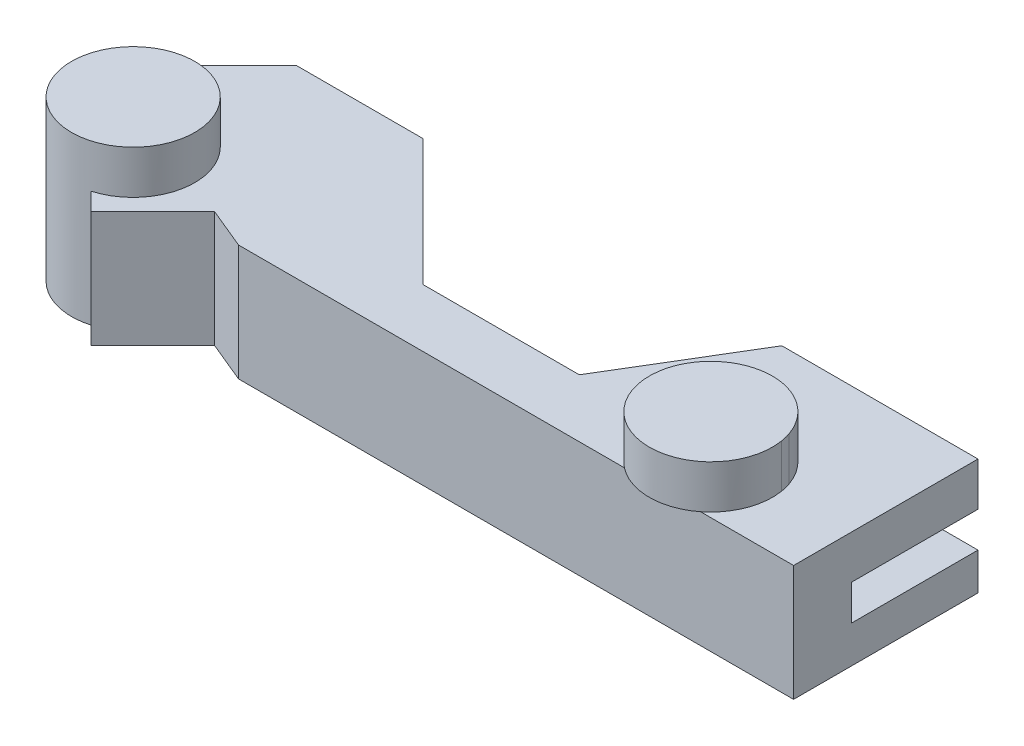
ISO-10303-21;
HEADER;
FILE_DESCRIPTION(('STEP AP214'),'2;1');
FILE_NAME('part.step','',(''),(''),'','','');
FILE_SCHEMA(('AUTOMOTIVE_DESIGN { 1 0 10303 214 1 1 1 1 }'));
ENDSEC;
DATA;
#1=APPLICATION_CONTEXT('core data for automotive mechanical design processes');
#2=APPLICATION_PROTOCOL_DEFINITION('international standard','automotive_design',2000,#1);
#3=PRODUCT_CONTEXT('',#1,'mechanical');
#4=PRODUCT('Part','Part','',(#3));
#5=PRODUCT_RELATED_PRODUCT_CATEGORY('part','',(#4));
#6=PRODUCT_DEFINITION_FORMATION('','',#4);
#7=PRODUCT_DEFINITION_CONTEXT('part definition',#1,'design');
#8=PRODUCT_DEFINITION('design','',#6,#7);
#9=PRODUCT_DEFINITION_SHAPE('','',#8);
#10=(LENGTH_UNIT() NAMED_UNIT(*) SI_UNIT(.MILLI.,.METRE.));
#11=(NAMED_UNIT(*) PLANE_ANGLE_UNIT() SI_UNIT($,.RADIAN.));
#12=(NAMED_UNIT(*) SI_UNIT($,.STERADIAN.) SOLID_ANGLE_UNIT());
#13=UNCERTAINTY_MEASURE_WITH_UNIT(LENGTH_MEASURE(1.E-05),#10,'distance_accuracy_value','');
#14=(GEOMETRIC_REPRESENTATION_CONTEXT(3) GLOBAL_UNCERTAINTY_ASSIGNED_CONTEXT((#13)) GLOBAL_UNIT_ASSIGNED_CONTEXT((#10,
#11,#12)) REPRESENTATION_CONTEXT('',''));
#15=CARTESIAN_POINT('',(0.,0.,0.));
#16=DIRECTION('',(0.,0.,1.));
#17=DIRECTION('',(1.,0.,0.));
#18=AXIS2_PLACEMENT_3D('',#15,#16,#17);
#19=CARTESIAN_POINT('',(29.2353300717633,6.,0.666861214855637));
#20=DIRECTION('',(0.,-1.,0.));
#21=DIRECTION('',(0.,0.,-1.));
#22=AXIS2_PLACEMENT_3D('',#19,#20,#21);
#23=CYLINDRICAL_SURFACE('',#22,4.25);
#24=DIRECTION('',(0.,-1.,0.));
#25=VECTOR('',#24,1.);
#26=CARTESIAN_POINT('',(33.2495376535951,4.5,-0.729074847420829));
#27=LINE('',#26,#25);
#28=CARTESIAN_POINT('',(33.2495376535951,6.,-0.729074847420828));
#29=VERTEX_POINT('',#28);
#30=CARTESIAN_POINT('',(33.2495376535951,3.,-0.729074847420828));
#31=VERTEX_POINT('',#30);
#32=EDGE_CURVE('E240',#29,#31,#27,.T.);
#33=ORIENTED_EDGE('',*,*,#32,.F.);
#34=CARTESIAN_POINT('',(29.2353300717633,6.,0.666861214855637));
#35=DIRECTION('',(0.,1.,0.));
#36=DIRECTION('',(0.,0.,1.));
#37=AXIS2_PLACEMENT_3D('',#34,#35,#36);
#38=CIRCLE('',#37,4.25);
#39=CARTESIAN_POINT('',(33.4326859204043,6.,0.));
#40=VERTEX_POINT('',#39);
#41=EDGE_CURVE('E528',#40,#29,#38,.T.);
#42=ORIENTED_EDGE('',*,*,#41,.F.);
#43=DIRECTION('',(0.,-1.,0.));
#44=VECTOR('',#43,1.);
#45=CARTESIAN_POINT('',(33.4326859204043,6.,0.));
#46=LINE('',#45,#44);
#47=CARTESIAN_POINT('',(33.4326859204043,3.,0.));
#48=VERTEX_POINT('',#47);
#49=EDGE_CURVE('E268',#40,#48,#46,.T.);
#50=ORIENTED_EDGE('',*,*,#49,.T.);
#51=CARTESIAN_POINT('',(29.2353300717633,3.,0.666861214855637));
#52=DIRECTION('',(0.,1.,0.));
#53=DIRECTION('',(0.,0.,1.));
#54=AXIS2_PLACEMENT_3D('',#51,#52,#53);
#55=CIRCLE('',#54,4.25);
#56=EDGE_CURVE('E49',#48,#31,#55,.T.);
#57=ORIENTED_EDGE('',*,*,#56,.T.);
#58=EDGE_LOOP('',(#33,#42,#50,#57));
#59=FACE_BOUND('',#58,.T.);
#60=ADVANCED_FACE('F45',(#59),#23,.T.);
#61=DIRECTION('',(0.,-1.,0.));
#62=VECTOR('',#61,1.);
#63=CARTESIAN_POINT('',(25.2211224899314,4.5,-0.729074847420827));
#64=LINE('',#63,#62);
#65=CARTESIAN_POINT('',(25.2211224899314,3.,-0.729074847420827));
#66=VERTEX_POINT('',#65);
#67=CARTESIAN_POINT('',(25.2211224899314,6.,-0.729074847420827));
#68=VERTEX_POINT('',#67);
#69=EDGE_CURVE('E255',#66,#68,#64,.F.);
#70=ORIENTED_EDGE('',*,*,#69,.F.);
#71=CARTESIAN_POINT('',(25.0379742231222,3.,0.));
#72=VERTEX_POINT('',#71);
#73=EDGE_CURVE('E263',#66,#72,#55,.T.);
#74=ORIENTED_EDGE('',*,*,#73,.T.);
#75=DIRECTION('',(0.,-1.,0.));
#76=VECTOR('',#75,1.);
#77=CARTESIAN_POINT('',(25.0379742231222,6.,0.));
#78=LINE('',#77,#76);
#79=CARTESIAN_POINT('',(25.0379742231222,6.,0.));
#80=VERTEX_POINT('',#79);
#81=EDGE_CURVE('E524',#80,#72,#78,.T.);
#82=ORIENTED_EDGE('',*,*,#81,.F.);
#83=EDGE_CURVE('E521',#68,#80,#38,.T.);
#84=ORIENTED_EDGE('',*,*,#83,.F.);
#85=EDGE_LOOP('',(#70,#74,#82,#84));
#86=FACE_BOUND('',#85,.T.);
#87=ADVANCED_FACE('F628',(#86),#23,.T.);
#88=CARTESIAN_POINT('',(0.,6.,0.));
#89=DIRECTION('',(0.,0.,1.));
#90=DIRECTION('',(1.,0.,0.));
#91=AXIS2_PLACEMENT_3D('',#88,#89,#90);
#92=PLANE('',#91);
#93=DIRECTION('',(1.,0.,0.));
#94=VECTOR('',#93,1.);
#95=CARTESIAN_POINT('',(0.,3.,0.));
#96=LINE('',#95,#94);
#97=CARTESIAN_POINT('',(25.0391661758015,3.,0.));
#98=VERTEX_POINT('',#97);
#99=EDGE_CURVE('E276',#72,#98,#96,.T.);
#100=ORIENTED_EDGE('',*,*,#99,.T.);
#101=DIRECTION('',(0.,-1.,0.));
#102=VECTOR('',#101,1.);
#103=CARTESIAN_POINT('',(25.0391661758015,6.,0.));
#104=LINE('',#103,#102);
#105=CARTESIAN_POINT('',(25.0391661758015,6.,0.));
#106=VERTEX_POINT('',#105);
#107=EDGE_CURVE('E11',#98,#106,#104,.F.);
#108=ORIENTED_EDGE('',*,*,#107,.T.);
#109=DIRECTION('',(-1.,0.,0.));
#110=VECTOR('',#109,1.);
#111=CARTESIAN_POINT('',(0.,6.,0.));
#112=LINE('',#111,#110);
#113=EDGE_CURVE('E511',#106,#80,#112,.T.);
#114=ORIENTED_EDGE('',*,*,#113,.T.);
#115=ORIENTED_EDGE('',*,*,#81,.T.);
#116=EDGE_LOOP('',(#100,#108,#114,#115));
#117=FACE_BOUND('',#116,.T.);
#118=ADVANCED_FACE('F608',(#117),#92,.T.);
#119=CARTESIAN_POINT('',(33.4314939677251,6.,0.));
#120=VERTEX_POINT('',#119);
#121=EDGE_CURVE('E518',#40,#120,#112,.T.);
#122=ORIENTED_EDGE('',*,*,#121,.T.);
#123=DIRECTION('',(0.,-1.,0.));
#124=VECTOR('',#123,1.);
#125=CARTESIAN_POINT('',(33.4314939677251,6.,0.));
#126=LINE('',#125,#124);
#127=CARTESIAN_POINT('',(33.4314939677251,3.,0.));
#128=VERTEX_POINT('',#127);
#129=EDGE_CURVE('E56',#120,#128,#126,.T.);
#130=ORIENTED_EDGE('',*,*,#129,.T.);
#131=EDGE_CURVE('E281',#128,#48,#96,.T.);
#132=ORIENTED_EDGE('',*,*,#131,.T.);
#133=ORIENTED_EDGE('',*,*,#49,.F.);
#134=EDGE_LOOP('',(#122,#130,#132,#133));
#135=FACE_BOUND('',#134,.T.);
#136=ADVANCED_FACE('F593',(#135),#92,.T.);
#137=CARTESIAN_POINT('',(0.,0.,0.));
#138=DIRECTION('',(0.,1.,0.));
#139=DIRECTION('',(0.,0.,1.));
#140=AXIS2_PLACEMENT_3D('',#137,#138,#139);
#141=PLANE('',#140);
#142=DIRECTION('',(1.,0.,0.));
#143=VECTOR('',#142,1.);
#144=CARTESIAN_POINT('',(0.,0.,0.));
#145=LINE('',#144,#143);
#146=CARTESIAN_POINT('',(19.4997551783498,0.,0.));
#147=VERTEX_POINT('',#146);
#148=CARTESIAN_POINT('',(38.28,0.,0.));
#149=VERTEX_POINT('',#148);
#150=EDGE_CURVE('E357',#147,#149,#145,.T.);
#151=ORIENTED_EDGE('',*,*,#150,.F.);
#152=DIRECTION('',(0.516250655987323,0.,-0.856437540158451));
#153=VECTOR('',#152,1.);
#154=CARTESIAN_POINT('',(14.3027830006851,0.,8.62155237284659));
#155=LINE('',#154,#153);
#156=CARTESIAN_POINT('',(24.755242586032,0.,-8.71862661203013));
#157=VERTEX_POINT('',#156);
#158=EDGE_CURVE('E309',#147,#157,#155,.T.);
#159=ORIENTED_EDGE('',*,*,#158,.T.);
#160=DIRECTION('',(-1.,0.,0.));
#161=VECTOR('',#160,1.);
#162=CARTESIAN_POINT('',(0.,0.,-8.71862661203013));
#163=LINE('',#162,#161);
#164=CARTESIAN_POINT('',(38.28,0.,-8.71862661203013));
#165=VERTEX_POINT('',#164);
#166=EDGE_CURVE('E305',#165,#157,#163,.T.);
#167=ORIENTED_EDGE('',*,*,#166,.F.);
#168=DIRECTION('',(0.,0.,1.));
#169=VECTOR('',#168,1.);
#170=CARTESIAN_POINT('',(38.28,0.,0.));
#171=LINE('',#170,#169);
#172=EDGE_CURVE('E301',#165,#149,#171,.T.);
#173=ORIENTED_EDGE('',*,*,#172,.T.);
#174=EDGE_LOOP('',(#151,#159,#167,#173));
#175=FACE_BOUND('',#174,.T.);
#176=ADVANCED_FACE('F693',(#175),#141,.F.);
#177=CARTESIAN_POINT('',(0.,0.,0.));
#178=VERTEX_POINT('',#177);
#179=CARTESIAN_POINT('',(8.71862661203034,0.,0.));
#180=VERTEX_POINT('',#179);
#181=EDGE_CURVE('E501',#178,#180,#145,.T.);
#182=ORIENTED_EDGE('',*,*,#181,.F.);
#183=DIRECTION('',(-0.707106781186548,0.,-0.707106781186548));
#184=VECTOR('',#183,1.);
#185=CARTESIAN_POINT('',(0.,0.,0.));
#186=LINE('',#185,#184);
#187=CARTESIAN_POINT('',(-8.71862661203013,0.,-8.71862661203013));
#188=VERTEX_POINT('',#187);
#189=EDGE_CURVE('E464',#178,#188,#186,.T.);
#190=ORIENTED_EDGE('',*,*,#189,.T.);
#191=DIRECTION('',(1.,0.,0.));
#192=VECTOR('',#191,1.);
#193=CARTESIAN_POINT('',(0.,0.,-8.71862661203013));
#194=LINE('',#193,#192);
#195=CARTESIAN_POINT('',(0.,0.,-8.71862661203013));
#196=VERTEX_POINT('',#195);
#197=EDGE_CURVE('E297',#188,#196,#194,.T.);
#198=ORIENTED_EDGE('',*,*,#197,.T.);
#199=DIRECTION('',(0.707106781186556,0.,0.707106781186539));
#200=VECTOR('',#199,1.);
#201=CARTESIAN_POINT('',(4.35931330601507,0.,-4.35931330601517));
#202=LINE('',#201,#200);
#203=EDGE_CURVE('E292',#196,#180,#202,.T.);
#204=ORIENTED_EDGE('',*,*,#203,.T.);
#205=EDGE_LOOP('',(#182,#190,#198,#204));
#206=FACE_BOUND('',#205,.T.);
#207=ADVANCED_FACE('F695',(#206),#141,.F.);
#208=CARTESIAN_POINT('',(-9.48275490536332,6.,1.78878128546955));
#209=DIRECTION('',(0.,-1.,0.));
#210=DIRECTION('',(0.,0.,-1.));
#211=AXIS2_PLACEMENT_3D('',#208,#209,#210);
#212=CYLINDRICAL_SURFACE('',#211,4.25);
#213=CARTESIAN_POINT('',(-9.48275490536332,6.,1.78878128546955));
#214=DIRECTION('',(0.,1.,0.));
#215=DIRECTION('',(0.,0.,1.));
#216=AXIS2_PLACEMENT_3D('',#213,#214,#215);
#217=CIRCLE('',#216,4.25);
#218=CARTESIAN_POINT('',(-9.48275490536332,6.,6.03878128546955));
#219=VERTEX_POINT('',#218);
#220=EDGE_CURVE('E353',#219,#219,#217,.T.);
#221=ORIENTED_EDGE('',*,*,#220,.F.);
#222=EDGE_LOOP('',(#221));
#223=FACE_BOUND('',#222,.T.);
#224=CARTESIAN_POINT('',(-9.48275490536332,3.,1.78878128546955));
#225=DIRECTION('',(0.,1.,0.));
#226=DIRECTION('',(0.,0.,1.));
#227=AXIS2_PLACEMENT_3D('',#224,#225,#226);
#228=CIRCLE('',#227,4.25);
#229=CARTESIAN_POINT('',(-8.29388432029366,3.,5.86911052855229));
#230=VERTEX_POINT('',#229);
#231=CARTESIAN_POINT('',(-13.5630841484461,3.,0.59991070039987));
#232=VERTEX_POINT('',#231);
#233=EDGE_CURVE('E562',#230,#232,#228,.T.);
#234=ORIENTED_EDGE('',*,*,#233,.T.);
#235=DIRECTION('',(0.,-1.,0.));
#236=VECTOR('',#235,1.);
#237=CARTESIAN_POINT('',(-13.5630841484461,3.,0.599910700399871));
#238=LINE('',#237,#236);
#239=CARTESIAN_POINT('',(-13.5630841484461,-5.,0.599910700399871));
#240=VERTEX_POINT('',#239);
#241=EDGE_CURVE('E333',#232,#240,#238,.T.);
#242=ORIENTED_EDGE('',*,*,#241,.T.);
#243=CARTESIAN_POINT('',(-9.48275490536332,-5.,1.78878128546955));
#244=DIRECTION('',(0.,1.,0.));
#245=DIRECTION('',(0.,0.,1.));
#246=AXIS2_PLACEMENT_3D('',#243,#244,#245);
#247=CIRCLE('',#246,4.25);
#248=CARTESIAN_POINT('',(-8.29388432029366,-5.,5.86911052855229));
#249=VERTEX_POINT('',#248);
#250=EDGE_CURVE('E463',#240,#249,#247,.T.);
#251=ORIENTED_EDGE('',*,*,#250,.T.);
#252=DIRECTION('',(0.,-1.,0.));
#253=VECTOR('',#252,1.);
#254=CARTESIAN_POINT('',(-8.29388432029366,3.,5.86911052855229));
#255=LINE('',#254,#253);
#256=EDGE_CURVE('E330',#230,#249,#255,.T.);
#257=ORIENTED_EDGE('',*,*,#256,.F.);
#258=EDGE_LOOP('',(#234,#242,#251,#257));
#259=FACE_BOUND('',#258,.T.);
#260=ADVANCED_FACE('F47',(#223,#259),#212,.T.);
#261=CARTESIAN_POINT('',(0.,6.,0.));
#262=DIRECTION('',(0.,1.,0.));
#263=DIRECTION('',(0.,0.,1.));
#264=AXIS2_PLACEMENT_3D('',#261,#262,#263);
#265=PLANE('',#264);
#266=ORIENTED_EDGE('',*,*,#220,.T.);
#267=EDGE_LOOP('',(#266));
#268=FACE_BOUND('',#267,.T.);
#269=ADVANCED_FACE('F646',(#268),#265,.T.);
#270=CARTESIAN_POINT('',(0.,3.,0.));
#271=DIRECTION('',(0.,0.,-1.));
#272=DIRECTION('',(-1.,0.,0.));
#273=AXIS2_PLACEMENT_3D('',#270,#271,#272);
#274=PLANE('',#273);
#275=DIRECTION('',(1.,0.,0.));
#276=VECTOR('',#275,1.);
#277=CARTESIAN_POINT('',(0.,-2.44,0.));
#278=LINE('',#277,#276);
#279=CARTESIAN_POINT('',(0.,-2.44,0.));
#280=VERTEX_POINT('',#279);
#281=CARTESIAN_POINT('',(8.71862661203009,-2.44,0.));
#282=VERTEX_POINT('',#281);
#283=EDGE_CURVE('E441',#280,#282,#278,.T.);
#284=ORIENTED_EDGE('',*,*,#283,.F.);
#285=DIRECTION('',(0.,1.,0.));
#286=VECTOR('',#285,1.);
#287=CARTESIAN_POINT('',(0.,-5.,0.));
#288=LINE('',#287,#286);
#289=EDGE_CURVE('E513',#280,#178,#288,.T.);
#290=ORIENTED_EDGE('',*,*,#289,.T.);
#291=ORIENTED_EDGE('',*,*,#181,.T.);
#292=DIRECTION('',(0.,-1.,0.));
#293=VECTOR('',#292,1.);
#294=CARTESIAN_POINT('',(8.71862661203034,3.,0.));
#295=LINE('',#294,#293);
#296=CARTESIAN_POINT('',(8.71862661203034,3.,0.));
#297=VERTEX_POINT('',#296);
#298=EDGE_CURVE('E349',#297,#180,#295,.T.);
#299=ORIENTED_EDGE('',*,*,#298,.F.);
#300=CARTESIAN_POINT('',(19.4997551783498,3.,0.));
#301=VERTEX_POINT('',#300);
#302=EDGE_CURVE('E283',#297,#301,#96,.T.);
#303=ORIENTED_EDGE('',*,*,#302,.T.);
#304=DIRECTION('',(0.,-1.,0.));
#305=VECTOR('',#304,1.);
#306=CARTESIAN_POINT('',(19.4997551783498,3.,0.));
#307=LINE('',#306,#305);
#308=EDGE_CURVE('E270',#301,#147,#307,.T.);
#309=ORIENTED_EDGE('',*,*,#308,.T.);
#310=ORIENTED_EDGE('',*,*,#150,.T.);
#311=DIRECTION('',(0.,1.,0.));
#312=VECTOR('',#311,1.);
#313=CARTESIAN_POINT('',(38.28,-5.,0.));
#314=LINE('',#313,#312);
#315=CARTESIAN_POINT('',(38.28,-2.44,0.));
#316=VERTEX_POINT('',#315);
#317=EDGE_CURVE('E500',#316,#149,#314,.T.);
#318=ORIENTED_EDGE('',*,*,#317,.F.);
#319=CARTESIAN_POINT('',(19.4997551783498,-2.44,0.));
#320=VERTEX_POINT('',#319);
#321=EDGE_CURVE('E458',#320,#316,#278,.T.);
#322=ORIENTED_EDGE('',*,*,#321,.F.);
#323=DIRECTION('',(0.,-1.,0.));
#324=VECTOR('',#323,1.);
#325=CARTESIAN_POINT('',(19.4997551783498,-2.44,0.));
#326=LINE('',#325,#324);
#327=CARTESIAN_POINT('',(19.4997551783498,-5.,0.));
#328=VERTEX_POINT('',#327);
#329=EDGE_CURVE('E445',#320,#328,#326,.T.);
#330=ORIENTED_EDGE('',*,*,#329,.T.);
#331=DIRECTION('',(1.,0.,0.));
#332=VECTOR('',#331,1.);
#333=CARTESIAN_POINT('',(0.,-5.,0.));
#334=LINE('',#333,#332);
#335=CARTESIAN_POINT('',(8.71862661203009,-5.,0.));
#336=VERTEX_POINT('',#335);
#337=EDGE_CURVE('E488',#336,#328,#334,.T.);
#338=ORIENTED_EDGE('',*,*,#337,.F.);
#339=DIRECTION('',(0.,-1.,0.));
#340=VECTOR('',#339,1.);
#341=CARTESIAN_POINT('',(8.71862661203009,-2.44,0.));
#342=LINE('',#341,#340);
#343=EDGE_CURVE('E449',#282,#336,#342,.T.);
#344=ORIENTED_EDGE('',*,*,#343,.F.);
#345=EDGE_LOOP('',(#284,#290,#291,#299,#303,#309,#310,#318,#322,#330,#338,#344));
#346=FACE_BOUND('',#345,.T.);
#347=ADVANCED_FACE('F642',(#346),#274,.T.);
#348=CARTESIAN_POINT('',(4.35931330601507,3.,-4.35931330601517));
#349=DIRECTION('',(0.707106781186539,0.,-0.707106781186556));
#350=DIRECTION('',(-0.707106781186556,0.,-0.707106781186539));
#351=AXIS2_PLACEMENT_3D('',#348,#349,#350);
#352=PLANE('',#351);
#353=ORIENTED_EDGE('',*,*,#203,.F.);
#354=DIRECTION('',(0.,-1.,0.));
#355=VECTOR('',#354,1.);
#356=CARTESIAN_POINT('',(0.,3.,-8.71862661203013));
#357=LINE('',#356,#355);
#358=CARTESIAN_POINT('',(0.,3.,-8.71862661203013));
#359=VERTEX_POINT('',#358);
#360=EDGE_CURVE('E346',#359,#196,#357,.T.);
#361=ORIENTED_EDGE('',*,*,#360,.F.);
#362=DIRECTION('',(0.707106781186556,0.,0.707106781186539));
#363=VECTOR('',#362,1.);
#364=CARTESIAN_POINT('',(4.35931330601507,3.,-4.35931330601517));
#365=LINE('',#364,#363);
#366=EDGE_CURVE('E543',#359,#297,#365,.T.);
#367=ORIENTED_EDGE('',*,*,#366,.T.);
#368=ORIENTED_EDGE('',*,*,#298,.T.);
#369=EDGE_LOOP('',(#353,#361,#367,#368));
#370=FACE_BOUND('',#369,.T.);
#371=ADVANCED_FACE('F645',(#370),#352,.T.);
#372=CARTESIAN_POINT('',(0.,3.,-8.71862661203013));
#373=DIRECTION('',(0.,0.,-1.));
#374=DIRECTION('',(-1.,0.,0.));
#375=AXIS2_PLACEMENT_3D('',#372,#373,#374);
#376=PLANE('',#375);
#377=ORIENTED_EDGE('',*,*,#197,.F.);
#378=DIRECTION('',(0.,-1.,0.));
#379=VECTOR('',#378,1.);
#380=CARTESIAN_POINT('',(-8.71862661203013,3.,-8.71862661203013));
#381=LINE('',#380,#379);
#382=CARTESIAN_POINT('',(-8.71862661203013,3.,-8.71862661203013));
#383=VERTEX_POINT('',#382);
#384=EDGE_CURVE('E342',#383,#188,#381,.T.);
#385=ORIENTED_EDGE('',*,*,#384,.F.);
#386=DIRECTION('',(1.,0.,0.));
#387=VECTOR('',#386,1.);
#388=CARTESIAN_POINT('',(0.,3.,-8.71862661203013));
#389=LINE('',#388,#387);
#390=EDGE_CURVE('E547',#383,#359,#389,.T.);
#391=ORIENTED_EDGE('',*,*,#390,.T.);
#392=ORIENTED_EDGE('',*,*,#360,.T.);
#393=EDGE_LOOP('',(#377,#385,#391,#392));
#394=FACE_BOUND('',#393,.T.);
#395=ADVANCED_FACE('F683',(#394),#376,.T.);
#396=CARTESIAN_POINT('',(-8.71862661203013,3.,-8.71862661203013));
#397=DIRECTION('',(0.707106781186547,0.,0.707106781186548));
#398=DIRECTION('',(0.707106781186548,0.,-0.707106781186547));
#399=AXIS2_PLACEMENT_3D('',#396,#397,#398);
#400=PLANE('',#399);
#401=ORIENTED_EDGE('',*,*,#384,.T.);
#402=DIRECTION('',(0.,1.,0.));
#403=VECTOR('',#402,1.);
#404=CARTESIAN_POINT('',(-8.71862661203013,-5.,-8.71862661203013));
#405=LINE('',#404,#403);
#406=CARTESIAN_POINT('',(-8.71862661203013,-2.44,-8.71862661203013));
#407=VERTEX_POINT('',#406);
#408=EDGE_CURVE('E512',#407,#188,#405,.T.);
#409=ORIENTED_EDGE('',*,*,#408,.F.);
#410=CARTESIAN_POINT('',(-8.71862661203013,-5.,-8.71862661203013));
#411=VERTEX_POINT('',#410);
#412=EDGE_CURVE('E507',#411,#407,#405,.T.);
#413=ORIENTED_EDGE('',*,*,#412,.F.);
#414=DIRECTION('',(-0.707106781186548,0.,0.707106781186547));
#415=VECTOR('',#414,1.);
#416=CARTESIAN_POINT('',(-8.71862661203013,-5.,-8.71862661203013));
#417=LINE('',#416,#415);
#418=CARTESIAN_POINT('',(-11.5614558189707,-5.,-5.87579740508959));
#419=VERTEX_POINT('',#418);
#420=EDGE_CURVE('E492',#411,#419,#417,.T.);
#421=ORIENTED_EDGE('',*,*,#420,.T.);
#422=DIRECTION('',(0.,-1.,0.));
#423=VECTOR('',#422,1.);
#424=CARTESIAN_POINT('',(-11.5614558189707,3.,-5.87579740508959));
#425=LINE('',#424,#423);
#426=CARTESIAN_POINT('',(-11.5614558189707,3.,-5.87579740508959));
#427=VERTEX_POINT('',#426);
#428=EDGE_CURVE('E339',#427,#419,#425,.T.);
#429=ORIENTED_EDGE('',*,*,#428,.F.);
#430=DIRECTION('',(-0.707106781186548,0.,0.707106781186547));
#431=VECTOR('',#430,1.);
#432=CARTESIAN_POINT('',(-8.71862661203013,3.,-8.71862661203013));
#433=LINE('',#432,#431);
#434=EDGE_CURVE('E551',#383,#427,#433,.T.);
#435=ORIENTED_EDGE('',*,*,#434,.F.);
#436=EDGE_LOOP('',(#401,#409,#413,#421,#429,#435));
#437=FACE_BOUND('',#436,.T.);
#438=ADVANCED_FACE('F679',(#437),#400,.F.);
#439=CARTESIAN_POINT('',(-8.85933722005975,3.,-8.6449319653497));
#440=DIRECTION('',(-0.715714260927428,0.,-0.698393224985112));
#441=DIRECTION('',(-0.698393224985112,0.,0.715714260927428));
#442=AXIS2_PLACEMENT_3D('',#439,#440,#441);
#443=PLANE('',#442);
#444=ORIENTED_EDGE('',*,*,#428,.T.);
#445=DIRECTION('',(0.698393224985112,0.,-0.715714260927429));
#446=VECTOR('',#445,1.);
#447=CARTESIAN_POINT('',(-8.85933722005975,-5.,-8.6449319653497));
#448=LINE('',#447,#446);
#449=CARTESIAN_POINT('',(-15.7482056884675,-5.,-1.58521083962163));
#450=VERTEX_POINT('',#449);
#451=EDGE_CURVE('E496',#450,#419,#448,.T.);
#452=ORIENTED_EDGE('',*,*,#451,.F.);
#453=DIRECTION('',(0.,-1.,0.));
#454=VECTOR('',#453,1.);
#455=CARTESIAN_POINT('',(-15.7482056884675,3.,-1.58521083962163));
#456=LINE('',#455,#454);
#457=CARTESIAN_POINT('',(-15.7482056884675,3.,-1.58521083962163));
#458=VERTEX_POINT('',#457);
#459=EDGE_CURVE('E336',#458,#450,#456,.T.);
#460=ORIENTED_EDGE('',*,*,#459,.F.);
#461=DIRECTION('',(0.698393224985112,0.,-0.715714260927429));
#462=VECTOR('',#461,1.);
#463=CARTESIAN_POINT('',(-8.85933722005975,3.,-8.6449319653497));
#464=LINE('',#463,#462);
#465=EDGE_CURVE('E554',#458,#427,#464,.T.);
#466=ORIENTED_EDGE('',*,*,#465,.T.);
#467=EDGE_LOOP('',(#444,#452,#460,#466));
#468=FACE_BOUND('',#467,.T.);
#469=ADVANCED_FACE('F675',(#468),#443,.T.);
#470=CARTESIAN_POINT('',(-7.08149742442298,3.,7.08149742442296));
#471=DIRECTION('',(-0.707106781186548,0.,0.707106781186546));
#472=DIRECTION('',(0.707106781186547,0.,0.707106781186549));
#473=AXIS2_PLACEMENT_3D('',#470,#471,#472);
#474=PLANE('',#473);
#475=ORIENTED_EDGE('',*,*,#459,.T.);
#476=DIRECTION('',(-0.707106781186547,0.,-0.707106781186549));
#477=VECTOR('',#476,1.);
#478=CARTESIAN_POINT('',(-7.08149742442298,-5.,7.08149742442296));
#479=LINE('',#478,#477);
#480=EDGE_CURVE('E459',#240,#450,#479,.T.);
#481=ORIENTED_EDGE('',*,*,#480,.F.);
#482=ORIENTED_EDGE('',*,*,#241,.F.);
#483=DIRECTION('',(-0.707106781186547,0.,-0.707106781186549));
#484=VECTOR('',#483,1.);
#485=CARTESIAN_POINT('',(-7.08149742442298,3.,7.08149742442296));
#486=LINE('',#485,#484);
#487=EDGE_CURVE('E558',#232,#458,#486,.T.);
#488=ORIENTED_EDGE('',*,*,#487,.T.);
#489=EDGE_LOOP('',(#475,#481,#482,#488));
#490=FACE_BOUND('',#489,.T.);
#491=ADVANCED_FACE('F671',(#490),#474,.T.);
#492=CARTESIAN_POINT('',(-7.081497424423,3.,7.08149742442296));
#493=DIRECTION('',(-0.707106781186549,0.,0.707106781186545));
#494=DIRECTION('',(0.707106781186546,0.,0.70710678118655));
#495=AXIS2_PLACEMENT_3D('',#492,#493,#494);
#496=PLANE('',#495);
#497=ORIENTED_EDGE('',*,*,#256,.T.);
#498=DIRECTION('',(-0.707106781186546,0.,-0.70710678118655));
#499=VECTOR('',#498,1.);
#500=CARTESIAN_POINT('',(-7.081497424423,-5.,7.08149742442296));
#501=LINE('',#500,#499);
#502=CARTESIAN_POINT('',(-7.08149742442299,-5.,7.08149742442297));
#503=VERTEX_POINT('',#502);
#504=EDGE_CURVE('E468',#503,#249,#501,.T.);
#505=ORIENTED_EDGE('',*,*,#504,.F.);
#506=DIRECTION('',(0.,-1.,0.));
#507=VECTOR('',#506,1.);
#508=CARTESIAN_POINT('',(-7.08149742442299,3.,7.08149742442297));
#509=LINE('',#508,#507);
#510=CARTESIAN_POINT('',(-7.08149742442299,3.,7.08149742442297));
#511=VERTEX_POINT('',#510);
#512=EDGE_CURVE('E327',#511,#503,#509,.T.);
#513=ORIENTED_EDGE('',*,*,#512,.F.);
#514=DIRECTION('',(-0.707106781186546,0.,-0.70710678118655));
#515=VECTOR('',#514,1.);
#516=CARTESIAN_POINT('',(-7.081497424423,3.,7.08149742442296));
#517=LINE('',#516,#515);
#518=EDGE_CURVE('E565',#511,#230,#517,.T.);
#519=ORIENTED_EDGE('',*,*,#518,.T.);
#520=EDGE_LOOP('',(#497,#505,#513,#519));
#521=FACE_BOUND('',#520,.T.);
#522=ADVANCED_FACE('F667',(#521),#496,.T.);
#523=CARTESIAN_POINT('',(0.,3.,0.));
#524=DIRECTION('',(0.707106781186546,0.,0.707106781186549));
#525=DIRECTION('',(0.707106781186549,0.,-0.707106781186546));
#526=AXIS2_PLACEMENT_3D('',#523,#524,#525);
#527=PLANE('',#526);
#528=ORIENTED_EDGE('',*,*,#512,.T.);
#529=DIRECTION('',(-0.707106781186549,0.,0.707106781186546));
#530=VECTOR('',#529,1.);
#531=CARTESIAN_POINT('',(0.,-5.,0.));
#532=LINE('',#531,#530);
#533=CARTESIAN_POINT('',(-2.82842712474619,-5.,2.82842712474619));
#534=VERTEX_POINT('',#533);
#535=EDGE_CURVE('E472',#534,#503,#532,.T.);
#536=ORIENTED_EDGE('',*,*,#535,.F.);
#537=DIRECTION('',(0.,-1.,0.));
#538=VECTOR('',#537,1.);
#539=CARTESIAN_POINT('',(-2.82842712474619,3.,2.82842712474619));
#540=LINE('',#539,#538);
#541=CARTESIAN_POINT('',(-2.82842712474619,3.,2.82842712474619));
#542=VERTEX_POINT('',#541);
#543=EDGE_CURVE('E324',#542,#534,#540,.T.);
#544=ORIENTED_EDGE('',*,*,#543,.F.);
#545=DIRECTION('',(-0.707106781186549,0.,0.707106781186546));
#546=VECTOR('',#545,1.);
#547=CARTESIAN_POINT('',(0.,3.,0.));
#548=LINE('',#547,#546);
#549=EDGE_CURVE('E569',#542,#511,#548,.T.);
#550=ORIENTED_EDGE('',*,*,#549,.T.);
#551=EDGE_LOOP('',(#528,#536,#544,#550));
#552=FACE_BOUND('',#551,.T.);
#553=ADVANCED_FACE('F663',(#552),#527,.T.);
#554=CARTESIAN_POINT('',(-1.41421356237309,3.,3.41421356237309));
#555=DIRECTION('',(0.38268343236509,0.,-0.923879532511287));
#556=DIRECTION('',(-0.923879532511287,0.,-0.38268343236509));
#557=AXIS2_PLACEMENT_3D('',#554,#555,#556);
#558=PLANE('',#557);
#559=ORIENTED_EDGE('',*,*,#543,.T.);
#560=DIRECTION('',(0.923879532511287,0.,0.38268343236509));
#561=VECTOR('',#560,1.);
#562=CARTESIAN_POINT('',(-1.41421356237309,-5.,3.41421356237309));
#563=LINE('',#562,#561);
#564=CARTESIAN_POINT('',(0.,-5.,4.));
#565=VERTEX_POINT('',#564);
#566=EDGE_CURVE('E476',#534,#565,#563,.T.);
#567=ORIENTED_EDGE('',*,*,#566,.T.);
#568=DIRECTION('',(0.,-1.,0.));
#569=VECTOR('',#568,1.);
#570=CARTESIAN_POINT('',(0.,3.,4.));
#571=LINE('',#570,#569);
#572=CARTESIAN_POINT('',(0.,3.,4.));
#573=VERTEX_POINT('',#572);
#574=EDGE_CURVE('E321',#573,#565,#571,.T.);
#575=ORIENTED_EDGE('',*,*,#574,.F.);
#576=DIRECTION('',(0.923879532511287,0.,0.38268343236509));
#577=VECTOR('',#576,1.);
#578=CARTESIAN_POINT('',(-1.41421356237309,3.,3.41421356237309));
#579=LINE('',#578,#577);
#580=EDGE_CURVE('E573',#542,#573,#579,.T.);
#581=ORIENTED_EDGE('',*,*,#580,.F.);
#582=EDGE_LOOP('',(#559,#567,#575,#581));
#583=FACE_BOUND('',#582,.T.);
#584=ADVANCED_FACE('F660',(#583),#558,.F.);
#585=CARTESIAN_POINT('',(0.,3.,4.));
#586=DIRECTION('',(0.,0.,1.));
#587=DIRECTION('',(1.,0.,0.));
#588=AXIS2_PLACEMENT_3D('',#585,#586,#587);
#589=PLANE('',#588);
#590=ORIENTED_EDGE('',*,*,#574,.T.);
#591=DIRECTION('',(-1.,0.,0.));
#592=VECTOR('',#591,1.);
#593=CARTESIAN_POINT('',(0.,-5.,4.));
#594=LINE('',#593,#592);
#595=CARTESIAN_POINT('',(38.28,-5.,4.));
#596=VERTEX_POINT('',#595);
#597=EDGE_CURVE('E480',#596,#565,#594,.T.);
#598=ORIENTED_EDGE('',*,*,#597,.F.);
#599=DIRECTION('',(0.,-1.,0.));
#600=VECTOR('',#599,1.);
#601=CARTESIAN_POINT('',(38.28,3.,4.));
#602=LINE('',#601,#600);
#603=CARTESIAN_POINT('',(38.28,3.,4.));
#604=VERTEX_POINT('',#603);
#605=EDGE_CURVE('E318',#604,#596,#602,.T.);
#606=ORIENTED_EDGE('',*,*,#605,.F.);
#607=DIRECTION('',(-1.,0.,0.));
#608=VECTOR('',#607,1.);
#609=CARTESIAN_POINT('',(0.,3.,4.));
#610=LINE('',#609,#608);
#611=CARTESIAN_POINT('',(31.859790290889,3.,4.));
#612=VERTEX_POINT('',#611);
#613=EDGE_CURVE('E576',#604,#612,#610,.T.);
#614=ORIENTED_EDGE('',*,*,#613,.T.);
#615=DIRECTION('',(-1.,0.,0.));
#616=VECTOR('',#615,1.);
#617=CARTESIAN_POINT('',(0.,3.,4.));
#618=LINE('',#617,#616);
#619=CARTESIAN_POINT('',(26.6108698526376,3.,4.));
#620=VERTEX_POINT('',#619);
#621=EDGE_CURVE('E370',#612,#620,#618,.T.);
#622=ORIENTED_EDGE('',*,*,#621,.T.);
#623=EDGE_CURVE('E64',#620,#573,#610,.T.);
#624=ORIENTED_EDGE('',*,*,#623,.T.);
#625=EDGE_LOOP('',(#590,#598,#606,#614,#622,#624));
#626=FACE_BOUND('',#625,.T.);
#627=ADVANCED_FACE('F617',(#626),#589,.T.);
#628=CARTESIAN_POINT('',(38.28,3.,0.));
#629=DIRECTION('',(1.,0.,0.));
#630=DIRECTION('',(0.,0.,-1.));
#631=AXIS2_PLACEMENT_3D('',#628,#629,#630);
#632=PLANE('',#631);
#633=ORIENTED_EDGE('',*,*,#605,.T.);
#634=DIRECTION('',(0.,0.,1.));
#635=VECTOR('',#634,1.);
#636=CARTESIAN_POINT('',(38.28,-5.,0.));
#637=LINE('',#636,#635);
#638=CARTESIAN_POINT('',(38.28,-5.,-8.71862661203013));
#639=VERTEX_POINT('',#638);
#640=EDGE_CURVE('E484',#639,#596,#637,.T.);
#641=ORIENTED_EDGE('',*,*,#640,.F.);
#642=DIRECTION('',(0.,-1.,0.));
#643=VECTOR('',#642,1.);
#644=CARTESIAN_POINT('',(38.28,-2.44,-8.71862661203013));
#645=LINE('',#644,#643);
#646=CARTESIAN_POINT('',(38.28,-2.44,-8.71862661203013));
#647=VERTEX_POINT('',#646);
#648=EDGE_CURVE('E437',#647,#639,#645,.T.);
#649=ORIENTED_EDGE('',*,*,#648,.F.);
#650=DIRECTION('',(0.,0.,1.));
#651=VECTOR('',#650,1.);
#652=CARTESIAN_POINT('',(38.28,-2.44,4.));
#653=LINE('',#652,#651);
#654=EDGE_CURVE('E418',#647,#316,#653,.T.);
#655=ORIENTED_EDGE('',*,*,#654,.T.);
#656=ORIENTED_EDGE('',*,*,#317,.T.);
#657=ORIENTED_EDGE('',*,*,#172,.F.);
#658=DIRECTION('',(0.,-1.,0.));
#659=VECTOR('',#658,1.);
#660=CARTESIAN_POINT('',(38.28,3.,-8.71862661203013));
#661=LINE('',#660,#659);
#662=CARTESIAN_POINT('',(38.28,3.,-8.71862661203013));
#663=VERTEX_POINT('',#662);
#664=EDGE_CURVE('E315',#663,#165,#661,.T.);
#665=ORIENTED_EDGE('',*,*,#664,.F.);
#666=DIRECTION('',(0.,0.,1.));
#667=VECTOR('',#666,1.);
#668=CARTESIAN_POINT('',(38.28,3.,0.));
#669=LINE('',#668,#667);
#670=EDGE_CURVE('E579',#663,#604,#669,.T.);
#671=ORIENTED_EDGE('',*,*,#670,.T.);
#672=EDGE_LOOP('',(#633,#641,#649,#655,#656,#657,#665,#671));
#673=FACE_BOUND('',#672,.T.);
#674=ADVANCED_FACE('F653',(#673),#632,.T.);
#675=CARTESIAN_POINT('',(0.,3.,-8.71862661203013));
#676=DIRECTION('',(0.,0.,1.));
#677=DIRECTION('',(1.,0.,0.));
#678=AXIS2_PLACEMENT_3D('',#675,#676,#677);
#679=PLANE('',#678);
#680=ORIENTED_EDGE('',*,*,#166,.T.);
#681=DIRECTION('',(0.,-1.,0.));
#682=VECTOR('',#681,1.);
#683=CARTESIAN_POINT('',(24.755242586032,3.,-8.71862661203013));
#684=LINE('',#683,#682);
#685=CARTESIAN_POINT('',(24.755242586032,3.,-8.71862661203013));
#686=VERTEX_POINT('',#685);
#687=EDGE_CURVE('E274',#686,#157,#684,.T.);
#688=ORIENTED_EDGE('',*,*,#687,.F.);
#689=DIRECTION('',(-1.,0.,0.));
#690=VECTOR('',#689,1.);
#691=CARTESIAN_POINT('',(0.,3.,-8.71862661203013));
#692=LINE('',#691,#690);
#693=EDGE_CURVE('E582',#663,#686,#692,.T.);
#694=ORIENTED_EDGE('',*,*,#693,.F.);
#695=ORIENTED_EDGE('',*,*,#664,.T.);
#696=EDGE_LOOP('',(#680,#688,#694,#695));
#697=FACE_BOUND('',#696,.T.);
#698=ADVANCED_FACE('F650',(#697),#679,.F.);
#699=CARTESIAN_POINT('',(14.3027830006851,3.,8.62155237284659));
#700=DIRECTION('',(-0.856437540158451,0.,-0.516250655987323));
#701=DIRECTION('',(-0.516250655987323,0.,0.856437540158451));
#702=AXIS2_PLACEMENT_3D('',#699,#700,#701);
#703=PLANE('',#702);
#704=ORIENTED_EDGE('',*,*,#158,.F.);
#705=ORIENTED_EDGE('',*,*,#308,.F.);
#706=DIRECTION('',(0.516250655987323,0.,-0.856437540158451));
#707=VECTOR('',#706,1.);
#708=CARTESIAN_POINT('',(14.3027830006851,3.,8.62155237284659));
#709=LINE('',#708,#707);
#710=EDGE_CURVE('E290',#301,#686,#709,.T.);
#711=ORIENTED_EDGE('',*,*,#710,.T.);
#712=ORIENTED_EDGE('',*,*,#687,.T.);
#713=EDGE_LOOP('',(#704,#705,#711,#712));
#714=FACE_BOUND('',#713,.T.);
#715=ADVANCED_FACE('F641',(#714),#703,.T.);
#716=CARTESIAN_POINT('',(0.,3.,0.));
#717=DIRECTION('',(0.,1.,0.));
#718=DIRECTION('',(0.,0.,1.));
#719=AXIS2_PLACEMENT_3D('',#716,#717,#718);
#720=PLANE('',#719);
#721=ORIENTED_EDGE('',*,*,#623,.F.);
#722=CARTESIAN_POINT('',(29.2353300717633,3.,0.66));
#723=DIRECTION('',(0.,1.,0.));
#724=DIRECTION('',(0.,0.,1.));
#725=AXIS2_PLACEMENT_3D('',#722,#723,#724);
#726=CIRCLE('',#725,4.24775133944694);
#727=EDGE_CURVE('E265',#98,#620,#726,.T.);
#728=ORIENTED_EDGE('',*,*,#727,.F.);
#729=ORIENTED_EDGE('',*,*,#99,.F.);
#730=ORIENTED_EDGE('',*,*,#73,.F.);
#731=CARTESIAN_POINT('',(29.2353300717633,3.,0.66));
#732=DIRECTION('',(0.,1.,0.));
#733=DIRECTION('',(0.945019437591296,0.,-0.327014162651453));
#734=AXIS2_PLACEMENT_3D('',#731,#732,#733);
#735=CIRCLE('',#734,4.24775133944694);
#736=EDGE_CURVE('E243',#31,#66,#735,.T.);
#737=ORIENTED_EDGE('',*,*,#736,.F.);
#738=ORIENTED_EDGE('',*,*,#56,.F.);
#739=ORIENTED_EDGE('',*,*,#131,.F.);
#740=EDGE_CURVE('E71',#612,#128,#726,.T.);
#741=ORIENTED_EDGE('',*,*,#740,.F.);
#742=ORIENTED_EDGE('',*,*,#613,.F.);
#743=ORIENTED_EDGE('',*,*,#670,.F.);
#744=ORIENTED_EDGE('',*,*,#693,.T.);
#745=ORIENTED_EDGE('',*,*,#710,.F.);
#746=ORIENTED_EDGE('',*,*,#302,.F.);
#747=ORIENTED_EDGE('',*,*,#366,.F.);
#748=ORIENTED_EDGE('',*,*,#390,.F.);
#749=ORIENTED_EDGE('',*,*,#434,.T.);
#750=ORIENTED_EDGE('',*,*,#465,.F.);
#751=ORIENTED_EDGE('',*,*,#487,.F.);
#752=ORIENTED_EDGE('',*,*,#233,.F.);
#753=ORIENTED_EDGE('',*,*,#518,.F.);
#754=ORIENTED_EDGE('',*,*,#549,.F.);
#755=ORIENTED_EDGE('',*,*,#580,.T.);
#756=EDGE_LOOP('',(#721,#728,#729,#730,#737,#738,#739,#741,#742,#743,#744,#745,#746,#747,#748,
#749,#750,#751,#752,#753,#754,#755));
#757=FACE_BOUND('',#756,.T.);
#758=ADVANCED_FACE('F260',(#757),#720,.T.);
#759=CARTESIAN_POINT('',(0.,6.,0.));
#760=DIRECTION('',(0.,1.,0.));
#761=DIRECTION('',(0.,0.,1.));
#762=AXIS2_PLACEMENT_3D('',#759,#760,#761);
#763=PLANE('',#762);
#764=ORIENTED_EDGE('',*,*,#41,.T.);
#765=CARTESIAN_POINT('',(33.2495376535951,6.,-0.729074847420831));
#766=CARTESIAN_POINT('',(33.0321955028238,6.,-1.35407231904915));
#767=CARTESIAN_POINT('',(32.6348227521104,6.,-1.88381507120379));
#768=CARTESIAN_POINT('',(32.2379037638939,6.,-2.41295290670657));
#769=CARTESIAN_POINT('',(31.6980289708702,6.,-2.79689601282899));
#770=CARTESIAN_POINT('',(31.1589824237197,6.,-3.18025009479747));
#771=CARTESIAN_POINT('',(30.5279111683178,6.,-3.38180944461147));
#772=CARTESIAN_POINT('',(29.8978080673383,6.,-3.58305957328093));
#773=CARTESIAN_POINT('',(29.2353300717633,6.,-3.58313878514436));
#774=CARTESIAN_POINT('',(28.5738684130857,6.,-3.58321787548536));
#775=CARTESIAN_POINT('',(27.9427489752087,6.,-3.38180944461147));
#776=CARTESIAN_POINT('',(27.3125977656732,6.,-3.18071000335079));
#777=CARTESIAN_POINT('',(26.7726311726563,6.,-2.79689601282899));
#778=CARTESIAN_POINT('',(26.233492966355,6.,-2.41367084838476));
#779=CARTESIAN_POINT('',(25.8358373914161,6.,-1.88381507120379));
#780=CARTESIAN_POINT('',(25.4386356007972,6.,-1.35456393849076));
#781=CARTESIAN_POINT('',(25.2211224899314,6.,-0.72907484742083));
#782=B_SPLINE_CURVE_WITH_KNOTS('',2,(#765,#766,#767,#768,#769,#770,#771,#772,#773,#774,#775,
#776,#777,#778,#779,#780,#781),.UNSPECIFIED.,.F.,.F.,(3,2,2,2,2,2,2,2,3),(0.,0.125,0.25,0.375,
0.5,0.625,0.75,0.875,1.),.UNSPECIFIED.);
#783=EDGE_CURVE('E247',#29,#68,#782,.T.);
#784=ORIENTED_EDGE('',*,*,#783,.T.);
#785=ORIENTED_EDGE('',*,*,#83,.T.);
#786=ORIENTED_EDGE('',*,*,#113,.F.);
#787=CARTESIAN_POINT('',(29.2353300717633,6.,0.66));
#788=DIRECTION('',(0.,1.,0.));
#789=DIRECTION('',(0.,0.,1.));
#790=AXIS2_PLACEMENT_3D('',#787,#788,#789);
#791=CIRCLE('',#790,4.24775133944694);
#792=EDGE_CURVE('E603',#106,#120,#791,.T.);
#793=ORIENTED_EDGE('',*,*,#792,.T.);
#794=ORIENTED_EDGE('',*,*,#121,.F.);
#795=EDGE_LOOP('',(#764,#784,#785,#786,#793,#794));
#796=FACE_BOUND('',#795,.T.);
#797=ADVANCED_FACE('F609',(#796),#763,.T.);
#798=CARTESIAN_POINT('',(0.,-5.,0.));
#799=DIRECTION('',(0.707106781186548,0.,-0.707106781186548));
#800=DIRECTION('',(-0.707106781186548,0.,-0.707106781186548));
#801=AXIS2_PLACEMENT_3D('',#798,#799,#800);
#802=PLANE('',#801);
#803=DIRECTION('',(0.707106781186548,0.,0.707106781186548));
#804=VECTOR('',#803,1.);
#805=CARTESIAN_POINT('',(0.,-2.44,0.));
#806=LINE('',#805,#804);
#807=EDGE_CURVE('E358',#407,#280,#806,.T.);
#808=ORIENTED_EDGE('',*,*,#807,.F.);
#809=ORIENTED_EDGE('',*,*,#408,.T.);
#810=ORIENTED_EDGE('',*,*,#189,.F.);
#811=ORIENTED_EDGE('',*,*,#289,.F.);
#812=EDGE_LOOP('',(#808,#809,#810,#811));
#813=FACE_BOUND('',#812,.T.);
#814=ADVANCED_FACE('F734',(#813),#802,.T.);
#815=CARTESIAN_POINT('',(0.,-5.,0.));
#816=DIRECTION('',(0.,1.,0.));
#817=DIRECTION('',(0.,0.,1.));
#818=AXIS2_PLACEMENT_3D('',#815,#816,#817);
#819=PLANE('',#818);
#820=DIRECTION('',(0.707106781186546,0.,0.707106781186549));
#821=VECTOR('',#820,1.);
#822=CARTESIAN_POINT('',(8.71862661203009,-5.,0.));
#823=LINE('',#822,#821);
#824=CARTESIAN_POINT('',(0.,-5.,-8.71862661203013));
#825=VERTEX_POINT('',#824);
#826=EDGE_CURVE('E426',#825,#336,#823,.T.);
#827=ORIENTED_EDGE('',*,*,#826,.T.);
#828=ORIENTED_EDGE('',*,*,#337,.T.);
#829=DIRECTION('',(0.516250655987323,0.,-0.856437540158451));
#830=VECTOR('',#829,1.);
#831=CARTESIAN_POINT('',(24.755242586032,-5.,-8.71862661203013));
#832=LINE('',#831,#830);
#833=CARTESIAN_POINT('',(24.755242586032,-5.,-8.71862661203013));
#834=VERTEX_POINT('',#833);
#835=EDGE_CURVE('E430',#328,#834,#832,.T.);
#836=ORIENTED_EDGE('',*,*,#835,.T.);
#837=DIRECTION('',(1.,0.,0.));
#838=VECTOR('',#837,1.);
#839=CARTESIAN_POINT('',(38.28,-5.,-8.71862661203013));
#840=LINE('',#839,#838);
#841=EDGE_CURVE('E406',#834,#639,#840,.T.);
#842=ORIENTED_EDGE('',*,*,#841,.T.);
#843=ORIENTED_EDGE('',*,*,#640,.T.);
#844=ORIENTED_EDGE('',*,*,#597,.T.);
#845=ORIENTED_EDGE('',*,*,#566,.F.);
#846=ORIENTED_EDGE('',*,*,#535,.T.);
#847=ORIENTED_EDGE('',*,*,#504,.T.);
#848=ORIENTED_EDGE('',*,*,#250,.F.);
#849=ORIENTED_EDGE('',*,*,#480,.T.);
#850=ORIENTED_EDGE('',*,*,#451,.T.);
#851=ORIENTED_EDGE('',*,*,#420,.F.);
#852=DIRECTION('',(1.,0.,0.));
#853=VECTOR('',#852,1.);
#854=CARTESIAN_POINT('',(0.,-5.,-8.71862661203013));
#855=LINE('',#854,#853);
#856=EDGE_CURVE('E254',#411,#825,#855,.T.);
#857=ORIENTED_EDGE('',*,*,#856,.T.);
#858=EDGE_LOOP('',(#827,#828,#836,#842,#843,#844,#845,#846,#847,#848,#849,#850,#851,#857));
#859=FACE_BOUND('',#858,.T.);
#860=ADVANCED_FACE('F717',(#859),#819,.F.);
#861=CARTESIAN_POINT('',(0.,-2.44,0.));
#862=DIRECTION('',(0.,1.,0.));
#863=DIRECTION('',(0.,0.,1.));
#864=AXIS2_PLACEMENT_3D('',#861,#862,#863);
#865=PLANE('',#864);
#866=ORIENTED_EDGE('',*,*,#807,.T.);
#867=ORIENTED_EDGE('',*,*,#283,.T.);
#868=DIRECTION('',(0.707106781186546,0.,0.707106781186549));
#869=VECTOR('',#868,1.);
#870=CARTESIAN_POINT('',(8.71862661203009,-2.44,0.));
#871=LINE('',#870,#869);
#872=CARTESIAN_POINT('',(0.,-2.44,-8.71862661203013));
#873=VERTEX_POINT('',#872);
#874=EDGE_CURVE('E405',#873,#282,#871,.T.);
#875=ORIENTED_EDGE('',*,*,#874,.F.);
#876=DIRECTION('',(1.,0.,0.));
#877=VECTOR('',#876,1.);
#878=CARTESIAN_POINT('',(0.,-2.44,-8.71862661203013));
#879=LINE('',#878,#877);
#880=EDGE_CURVE('E396',#407,#873,#879,.T.);
#881=ORIENTED_EDGE('',*,*,#880,.F.);
#882=EDGE_LOOP('',(#866,#867,#875,#881));
#883=FACE_BOUND('',#882,.T.);
#884=ADVANCED_FACE('F390',(#883),#865,.T.);
#885=CARTESIAN_POINT('',(0.,-2.44,-8.71862661203013));
#886=DIRECTION('',(0.,0.,-1.));
#887=DIRECTION('',(-1.,0.,0.));
#888=AXIS2_PLACEMENT_3D('',#885,#886,#887);
#889=PLANE('',#888);
#890=ORIENTED_EDGE('',*,*,#856,.F.);
#891=ORIENTED_EDGE('',*,*,#412,.T.);
#892=ORIENTED_EDGE('',*,*,#880,.T.);
#893=DIRECTION('',(0.,-1.,0.));
#894=VECTOR('',#893,1.);
#895=CARTESIAN_POINT('',(0.,-2.44,-8.71862661203013));
#896=LINE('',#895,#894);
#897=EDGE_CURVE('E422',#873,#825,#896,.T.);
#898=ORIENTED_EDGE('',*,*,#897,.T.);
#899=EDGE_LOOP('',(#890,#891,#892,#898));
#900=FACE_BOUND('',#899,.T.);
#901=ADVANCED_FACE('F726',(#900),#889,.T.);
#902=CARTESIAN_POINT('',(8.71862661203009,-2.44,0.));
#903=DIRECTION('',(0.707106781186549,0.,-0.707106781186546));
#904=DIRECTION('',(-0.707106781186546,0.,-0.707106781186549));
#905=AXIS2_PLACEMENT_3D('',#902,#903,#904);
#906=PLANE('',#905);
#907=ORIENTED_EDGE('',*,*,#826,.F.);
#908=ORIENTED_EDGE('',*,*,#897,.F.);
#909=ORIENTED_EDGE('',*,*,#874,.T.);
#910=ORIENTED_EDGE('',*,*,#343,.T.);
#911=EDGE_LOOP('',(#907,#908,#909,#910));
#912=FACE_BOUND('',#911,.T.);
#913=ADVANCED_FACE('F720',(#912),#906,.T.);
#914=DIRECTION('',(0.516250655987323,0.,-0.856437540158451));
#915=VECTOR('',#914,1.);
#916=CARTESIAN_POINT('',(24.755242586032,-2.44,-8.71862661203013));
#917=LINE('',#916,#915);
#918=CARTESIAN_POINT('',(24.755242586032,-2.44,-8.71862661203013));
#919=VERTEX_POINT('',#918);
#920=EDGE_CURVE('E410',#320,#919,#917,.T.);
#921=ORIENTED_EDGE('',*,*,#920,.F.);
#922=ORIENTED_EDGE('',*,*,#321,.T.);
#923=ORIENTED_EDGE('',*,*,#654,.F.);
#924=DIRECTION('',(1.,0.,0.));
#925=VECTOR('',#924,1.);
#926=CARTESIAN_POINT('',(38.28,-2.44,-8.71862661203013));
#927=LINE('',#926,#925);
#928=EDGE_CURVE('E414',#919,#647,#927,.T.);
#929=ORIENTED_EDGE('',*,*,#928,.F.);
#930=EDGE_LOOP('',(#921,#922,#923,#929));
#931=FACE_BOUND('',#930,.T.);
#932=ADVANCED_FACE('F713',(#931),#865,.T.);
#933=CARTESIAN_POINT('',(38.28,-2.44,-8.71862661203013));
#934=DIRECTION('',(0.,0.,-1.));
#935=DIRECTION('',(-1.,0.,0.));
#936=AXIS2_PLACEMENT_3D('',#933,#934,#935);
#937=PLANE('',#936);
#938=ORIENTED_EDGE('',*,*,#841,.F.);
#939=DIRECTION('',(0.,-1.,0.));
#940=VECTOR('',#939,1.);
#941=CARTESIAN_POINT('',(24.755242586032,-2.44,-8.71862661203013));
#942=LINE('',#941,#940);
#943=EDGE_CURVE('E442',#919,#834,#942,.T.);
#944=ORIENTED_EDGE('',*,*,#943,.F.);
#945=ORIENTED_EDGE('',*,*,#928,.T.);
#946=ORIENTED_EDGE('',*,*,#648,.T.);
#947=EDGE_LOOP('',(#938,#944,#945,#946));
#948=FACE_BOUND('',#947,.T.);
#949=ADVANCED_FACE('F624',(#948),#937,.T.);
#950=CARTESIAN_POINT('',(24.755242586032,-2.44,-8.71862661203013));
#951=DIRECTION('',(-0.856437540158451,0.,-0.516250655987323));
#952=DIRECTION('',(-0.516250655987323,0.,0.856437540158451));
#953=AXIS2_PLACEMENT_3D('',#950,#951,#952);
#954=PLANE('',#953);
#955=ORIENTED_EDGE('',*,*,#835,.F.);
#956=ORIENTED_EDGE('',*,*,#329,.F.);
#957=ORIENTED_EDGE('',*,*,#920,.T.);
#958=ORIENTED_EDGE('',*,*,#943,.T.);
#959=EDGE_LOOP('',(#955,#956,#957,#958));
#960=FACE_BOUND('',#959,.T.);
#961=ADVANCED_FACE('F620',(#960),#954,.T.);
#962=CARTESIAN_POINT('',(0.,3.,0.));
#963=DIRECTION('',(0.,1.,0.));
#964=DIRECTION('',(0.,0.,1.));
#965=AXIS2_PLACEMENT_3D('',#962,#963,#964);
#966=PLANE('',#965);
#967=ORIENTED_EDGE('',*,*,#621,.F.);
#968=EDGE_CURVE('E601',#620,#612,#726,.T.);
#969=ORIENTED_EDGE('',*,*,#968,.F.);
#970=EDGE_LOOP('',(#967,#969));
#971=FACE_BOUND('',#970,.T.);
#972=ADVANCED_FACE('F388',(#971),#966,.F.);
#973=CARTESIAN_POINT('',(29.2353300717633,6.,0.66));
#974=DIRECTION('',(0.,-1.,0.));
#975=DIRECTION('',(0.,0.,-1.));
#976=AXIS2_PLACEMENT_3D('',#973,#974,#975);
#977=CYLINDRICAL_SURFACE('',#976,4.24775133944694);
#978=ORIENTED_EDGE('',*,*,#107,.F.);
#979=ORIENTED_EDGE('',*,*,#727,.T.);
#980=ORIENTED_EDGE('',*,*,#968,.T.);
#981=ORIENTED_EDGE('',*,*,#740,.T.);
#982=ORIENTED_EDGE('',*,*,#129,.F.);
#983=ORIENTED_EDGE('',*,*,#792,.F.);
#984=EDGE_LOOP('',(#978,#979,#980,#981,#982,#983));
#985=FACE_BOUND('',#984,.T.);
#986=ADVANCED_FACE('F378',(#985),#977,.T.);
#987=ORIENTED_EDGE('',*,*,#783,.F.);
#988=ORIENTED_EDGE('',*,*,#32,.T.);
#989=ORIENTED_EDGE('',*,*,#736,.T.);
#990=ORIENTED_EDGE('',*,*,#69,.T.);
#991=EDGE_LOOP('',(#987,#988,#989,#990));
#992=FACE_BOUND('',#991,.T.);
#993=ADVANCED_FACE('F242',(#992),#977,.T.);
#994=CLOSED_SHELL('',(#60,#87,#118,#136,#176,#207,#260,#269,#347,#371,#395,#438,#469,#491,#522,
#553,#584,#627,#674,#698,#715,#758,#797,#814,#860,#884,#901,#913,#932,#949,#961,#972,#986,#993));
#995=MANIFOLD_SOLID_BREP('B2',#994);
#996=ADVANCED_BREP_SHAPE_REPRESENTATION('',(#18,#995),#14);
#997=SHAPE_DEFINITION_REPRESENTATION(#9,#996);
ENDSEC;
END-ISO-10303-21;
